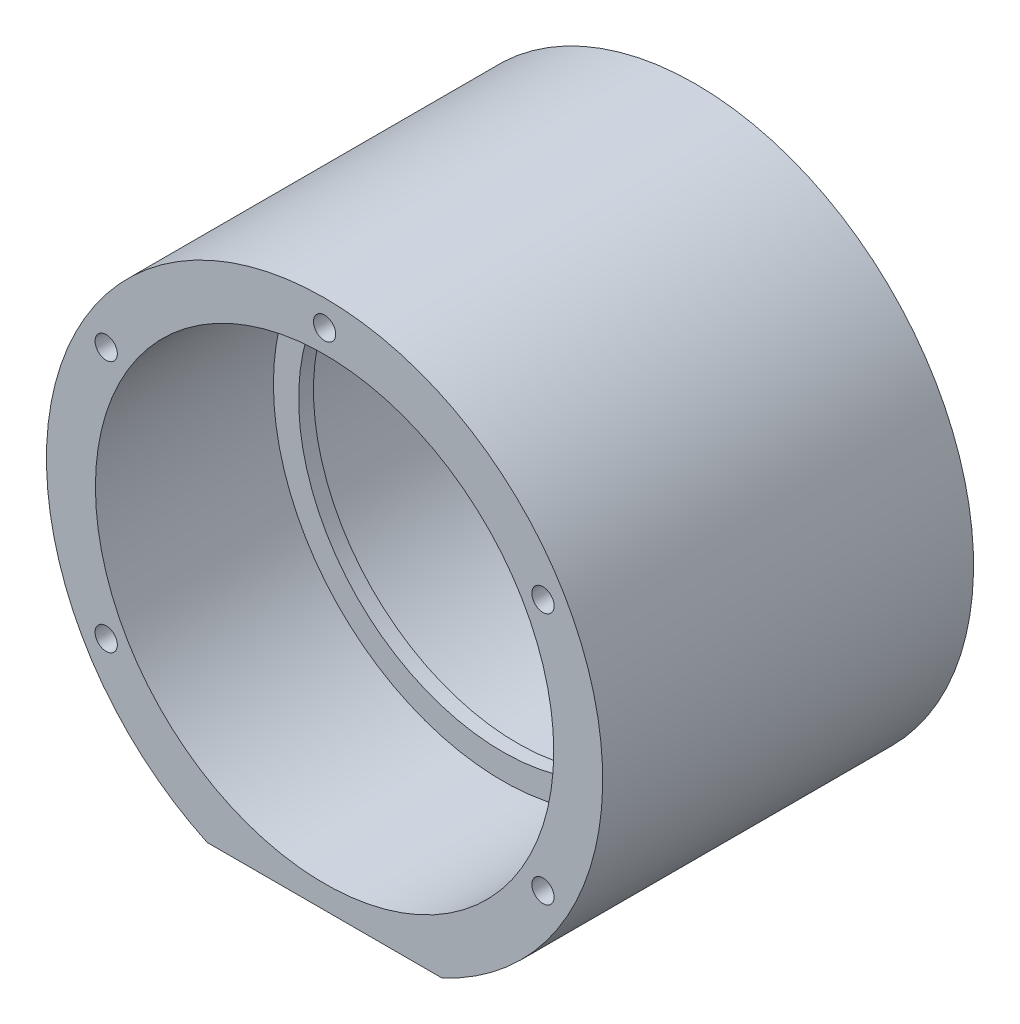
ISO-10303-21;
HEADER;
FILE_DESCRIPTION(('STEP AP214'),'2;1');
FILE_NAME('part.step','',(''),(''),'','','');
FILE_SCHEMA(('AUTOMOTIVE_DESIGN { 1 0 10303 214 1 1 1 1 }'));
ENDSEC;
DATA;
#1=APPLICATION_CONTEXT('core data for automotive mechanical design processes');
#2=APPLICATION_PROTOCOL_DEFINITION('international standard','automotive_design',2000,#1);
#3=PRODUCT_CONTEXT('',#1,'mechanical');
#4=PRODUCT('Part','Part','',(#3));
#5=PRODUCT_RELATED_PRODUCT_CATEGORY('part','',(#4));
#6=PRODUCT_DEFINITION_FORMATION('','',#4);
#7=PRODUCT_DEFINITION_CONTEXT('part definition',#1,'design');
#8=PRODUCT_DEFINITION('design','',#6,#7);
#9=PRODUCT_DEFINITION_SHAPE('','',#8);
#10=(LENGTH_UNIT() NAMED_UNIT(*) SI_UNIT(.MILLI.,.METRE.));
#11=(NAMED_UNIT(*) PLANE_ANGLE_UNIT() SI_UNIT($,.RADIAN.));
#12=(NAMED_UNIT(*) SI_UNIT($,.STERADIAN.) SOLID_ANGLE_UNIT());
#13=UNCERTAINTY_MEASURE_WITH_UNIT(LENGTH_MEASURE(1.E-05),#10,'distance_accuracy_value','');
#14=(GEOMETRIC_REPRESENTATION_CONTEXT(3) GLOBAL_UNCERTAINTY_ASSIGNED_CONTEXT((#13)) GLOBAL_UNIT_ASSIGNED_CONTEXT((#10,
#11,#12)) REPRESENTATION_CONTEXT('',''));
#15=CARTESIAN_POINT('',(0.,0.,0.));
#16=DIRECTION('',(0.,0.,1.));
#17=DIRECTION('',(1.,0.,0.));
#18=AXIS2_PLACEMENT_3D('',#15,#16,#17);
#19=CARTESIAN_POINT('',(0.,0.,50.));
#20=DIRECTION('',(0.,0.,-1.));
#21=DIRECTION('',(-1.,0.,0.));
#22=AXIS2_PLACEMENT_3D('',#19,#20,#21);
#23=CYLINDRICAL_SURFACE('',#22,30.9);
#24=CARTESIAN_POINT('',(0.,0.,0.));
#25=DIRECTION('',(0.,0.,1.));
#26=DIRECTION('',(1.,0.,0.));
#27=AXIS2_PLACEMENT_3D('',#24,#25,#26);
#28=CIRCLE('',#27,30.9);
#29=CARTESIAN_POINT('',(30.9,0.,0.));
#30=VERTEX_POINT('',#29);
#31=EDGE_CURVE('E76',#30,#30,#28,.T.);
#32=ORIENTED_EDGE('',*,*,#31,.F.);
#33=EDGE_LOOP('',(#32));
#34=FACE_BOUND('',#33,.T.);
#35=CARTESIAN_POINT('',(0.,0.,24.));
#36=DIRECTION('',(0.,0.,1.));
#37=DIRECTION('',(1.,0.,0.));
#38=AXIS2_PLACEMENT_3D('',#35,#36,#37);
#39=CIRCLE('',#38,30.9);
#40=CARTESIAN_POINT('',(30.9,0.,24.));
#41=VERTEX_POINT('',#40);
#42=EDGE_CURVE('E111',#41,#41,#39,.T.);
#43=ORIENTED_EDGE('',*,*,#42,.T.);
#44=EDGE_LOOP('',(#43));
#45=FACE_BOUND('',#44,.T.);
#46=ADVANCED_FACE('F33',(#34,#45),#23,.F.);
#47=CARTESIAN_POINT('',(0.,0.,50.));
#48=DIRECTION('',(0.,0.,1.));
#49=DIRECTION('',(1.,0.,0.));
#50=AXIS2_PLACEMENT_3D('',#47,#48,#49);
#51=PLANE('',#50);
#52=CARTESIAN_POINT('',(-29.444863728671,-16.9999999999999,50.));
#53=DIRECTION('',(0.,0.,1.));
#54=DIRECTION('',(1.,0.,0.));
#55=AXIS2_PLACEMENT_3D('',#52,#53,#54);
#56=CIRCLE('',#55,1.50000000000016);
#57=CARTESIAN_POINT('',(-27.9448637286709,-16.9999999999999,50.));
#58=VERTEX_POINT('',#57);
#59=EDGE_CURVE('E99',#58,#58,#56,.T.);
#60=ORIENTED_EDGE('',*,*,#59,.F.);
#61=EDGE_LOOP('',(#60));
#62=FACE_BOUND('',#61,.T.);
#63=CARTESIAN_POINT('',(29.444863728671,16.9999999999999,50.));
#64=DIRECTION('',(0.,0.,1.));
#65=DIRECTION('',(1.,0.,0.));
#66=AXIS2_PLACEMENT_3D('',#63,#64,#65);
#67=CIRCLE('',#66,1.5);
#68=CARTESIAN_POINT('',(30.944863728671,16.9999999999999,50.));
#69=VERTEX_POINT('',#68);
#70=EDGE_CURVE('E87',#69,#69,#67,.T.);
#71=ORIENTED_EDGE('',*,*,#70,.F.);
#72=EDGE_LOOP('',(#71));
#73=FACE_BOUND('',#72,.T.);
#74=CARTESIAN_POINT('',(0.,0.,50.));
#75=DIRECTION('',(0.,0.,1.));
#76=DIRECTION('',(1.,0.,0.));
#77=AXIS2_PLACEMENT_3D('',#74,#75,#76);
#78=CIRCLE('',#77,30.9);
#79=CARTESIAN_POINT('',(30.9,0.,50.));
#80=VERTEX_POINT('',#79);
#81=EDGE_CURVE('E73',#80,#80,#78,.T.);
#82=ORIENTED_EDGE('',*,*,#81,.F.);
#83=EDGE_LOOP('',(#82));
#84=FACE_BOUND('',#83,.T.);
#85=CARTESIAN_POINT('',(0.,0.,50.));
#86=DIRECTION('',(0.,0.,1.));
#87=DIRECTION('',(1.,0.,0.));
#88=AXIS2_PLACEMENT_3D('',#85,#86,#87);
#89=CIRCLE('',#88,37.5);
#90=CARTESIAN_POINT('',(15.8192920195564,-34.,50.));
#91=VERTEX_POINT('',#90);
#92=CARTESIAN_POINT('',(-15.8192920195564,-34.,50.));
#93=VERTEX_POINT('',#92);
#94=EDGE_CURVE('E66',#91,#93,#89,.T.);
#95=ORIENTED_EDGE('',*,*,#94,.T.);
#96=DIRECTION('',(1.,0.,0.));
#97=VECTOR('',#96,1.);
#98=CARTESIAN_POINT('',(-15.8192920195564,-34.,50.));
#99=LINE('',#98,#97);
#100=EDGE_CURVE('E49',#93,#91,#99,.T.);
#101=ORIENTED_EDGE('',*,*,#100,.T.);
#102=EDGE_LOOP('',(#95,#101));
#103=FACE_BOUND('',#102,.T.);
#104=CARTESIAN_POINT('',(0.,34.,50.));
#105=DIRECTION('',(0.,0.,1.));
#106=DIRECTION('',(1.,0.,0.));
#107=AXIS2_PLACEMENT_3D('',#104,#105,#106);
#108=CIRCLE('',#107,1.5);
#109=CARTESIAN_POINT('',(1.5,34.,50.));
#110=VERTEX_POINT('',#109);
#111=EDGE_CURVE('E82',#110,#110,#108,.T.);
#112=ORIENTED_EDGE('',*,*,#111,.F.);
#113=EDGE_LOOP('',(#112));
#114=FACE_BOUND('',#113,.T.);
#115=CARTESIAN_POINT('',(29.4448637286708,-17.0000000000001,50.));
#116=DIRECTION('',(0.,0.,1.));
#117=DIRECTION('',(1.,0.,0.));
#118=AXIS2_PLACEMENT_3D('',#115,#116,#117);
#119=CIRCLE('',#118,1.50000000000005);
#120=CARTESIAN_POINT('',(30.9448637286708,-17.0000000000001,50.));
#121=VERTEX_POINT('',#120);
#122=EDGE_CURVE('E93',#121,#121,#119,.T.);
#123=ORIENTED_EDGE('',*,*,#122,.F.);
#124=EDGE_LOOP('',(#123));
#125=FACE_BOUND('',#124,.T.);
#126=CARTESIAN_POINT('',(-29.4448637286707,17.0000000000003,50.));
#127=DIRECTION('',(0.,0.,1.));
#128=DIRECTION('',(1.,0.,0.));
#129=AXIS2_PLACEMENT_3D('',#126,#127,#128);
#130=CIRCLE('',#129,1.5);
#131=CARTESIAN_POINT('',(-27.9448637286707,17.0000000000003,50.));
#132=VERTEX_POINT('',#131);
#133=EDGE_CURVE('E105',#132,#132,#130,.T.);
#134=ORIENTED_EDGE('',*,*,#133,.F.);
#135=EDGE_LOOP('',(#134));
#136=FACE_BOUND('',#135,.T.);
#137=ADVANCED_FACE('F136',(#62,#73,#84,#103,#114,#125,#136),#51,.T.);
#138=CARTESIAN_POINT('',(0.,0.,0.));
#139=DIRECTION('',(0.,0.,1.));
#140=DIRECTION('',(1.,0.,0.));
#141=AXIS2_PLACEMENT_3D('',#138,#139,#140);
#142=PLANE('',#141);
#143=CARTESIAN_POINT('',(0.,0.,0.));
#144=DIRECTION('',(0.,0.,1.));
#145=DIRECTION('',(1.,0.,0.));
#146=AXIS2_PLACEMENT_3D('',#143,#144,#145);
#147=CIRCLE('',#146,37.5);
#148=CARTESIAN_POINT('',(15.8192920195564,-34.,0.));
#149=VERTEX_POINT('',#148);
#150=CARTESIAN_POINT('',(-15.8192920195564,-34.,0.));
#151=VERTEX_POINT('',#150);
#152=EDGE_CURVE('E67',#149,#151,#147,.T.);
#153=ORIENTED_EDGE('',*,*,#152,.F.);
#154=DIRECTION('',(1.,0.,0.));
#155=VECTOR('',#154,1.);
#156=CARTESIAN_POINT('',(-15.8192920195564,-34.,0.));
#157=LINE('',#156,#155);
#158=EDGE_CURVE('E57',#151,#149,#157,.T.);
#159=ORIENTED_EDGE('',*,*,#158,.F.);
#160=EDGE_LOOP('',(#153,#159));
#161=FACE_BOUND('',#160,.T.);
#162=ORIENTED_EDGE('',*,*,#31,.T.);
#163=EDGE_LOOP('',(#162));
#164=FACE_BOUND('',#163,.T.);
#165=CARTESIAN_POINT('',(0.,34.,0.));
#166=DIRECTION('',(0.,0.,1.));
#167=DIRECTION('',(1.,0.,0.));
#168=AXIS2_PLACEMENT_3D('',#165,#166,#167);
#169=CIRCLE('',#168,1.5);
#170=CARTESIAN_POINT('',(1.5,34.,0.));
#171=VERTEX_POINT('',#170);
#172=EDGE_CURVE('E84',#171,#171,#169,.T.);
#173=ORIENTED_EDGE('',*,*,#172,.T.);
#174=EDGE_LOOP('',(#173));
#175=FACE_BOUND('',#174,.T.);
#176=CARTESIAN_POINT('',(29.444863728671,16.9999999999999,0.));
#177=DIRECTION('',(0.,0.,1.));
#178=DIRECTION('',(1.,0.,0.));
#179=AXIS2_PLACEMENT_3D('',#176,#177,#178);
#180=CIRCLE('',#179,1.5);
#181=CARTESIAN_POINT('',(30.944863728671,16.9999999999999,0.));
#182=VERTEX_POINT('',#181);
#183=EDGE_CURVE('E90',#182,#182,#180,.T.);
#184=ORIENTED_EDGE('',*,*,#183,.T.);
#185=EDGE_LOOP('',(#184));
#186=FACE_BOUND('',#185,.T.);
#187=CARTESIAN_POINT('',(29.4448637286708,-17.0000000000001,0.));
#188=DIRECTION('',(0.,0.,1.));
#189=DIRECTION('',(1.,0.,0.));
#190=AXIS2_PLACEMENT_3D('',#187,#188,#189);
#191=CIRCLE('',#190,1.50000000000005);
#192=CARTESIAN_POINT('',(30.9448637286708,-17.0000000000001,0.));
#193=VERTEX_POINT('',#192);
#194=EDGE_CURVE('E96',#193,#193,#191,.T.);
#195=ORIENTED_EDGE('',*,*,#194,.T.);
#196=EDGE_LOOP('',(#195));
#197=FACE_BOUND('',#196,.T.);
#198=CARTESIAN_POINT('',(-29.444863728671,-16.9999999999999,0.));
#199=DIRECTION('',(0.,0.,1.));
#200=DIRECTION('',(1.,0.,0.));
#201=AXIS2_PLACEMENT_3D('',#198,#199,#200);
#202=CIRCLE('',#201,1.50000000000016);
#203=CARTESIAN_POINT('',(-27.9448637286709,-16.9999999999999,0.));
#204=VERTEX_POINT('',#203);
#205=EDGE_CURVE('E102',#204,#204,#202,.T.);
#206=ORIENTED_EDGE('',*,*,#205,.T.);
#207=EDGE_LOOP('',(#206));
#208=FACE_BOUND('',#207,.T.);
#209=CARTESIAN_POINT('',(-29.4448637286707,17.0000000000003,0.));
#210=DIRECTION('',(0.,0.,1.));
#211=DIRECTION('',(1.,0.,0.));
#212=AXIS2_PLACEMENT_3D('',#209,#210,#211);
#213=CIRCLE('',#212,1.5);
#214=CARTESIAN_POINT('',(-27.9448637286707,17.0000000000003,0.));
#215=VERTEX_POINT('',#214);
#216=EDGE_CURVE('E108',#215,#215,#213,.T.);
#217=ORIENTED_EDGE('',*,*,#216,.T.);
#218=EDGE_LOOP('',(#217));
#219=FACE_BOUND('',#218,.T.);
#220=ADVANCED_FACE('F71',(#161,#164,#175,#186,#197,#208,#219),#142,.F.);
#221=CARTESIAN_POINT('',(0.,0.,50.));
#222=DIRECTION('',(0.,0.,-1.));
#223=DIRECTION('',(-1.,0.,0.));
#224=AXIS2_PLACEMENT_3D('',#221,#222,#223);
#225=CYLINDRICAL_SURFACE('',#224,37.5);
#226=ORIENTED_EDGE('',*,*,#152,.T.);
#227=DIRECTION('',(0.,0.,-1.));
#228=VECTOR('',#227,1.);
#229=CARTESIAN_POINT('',(-15.8192920195564,-34.,50.));
#230=LINE('',#229,#228);
#231=EDGE_CURVE('E42',#93,#151,#230,.T.);
#232=ORIENTED_EDGE('',*,*,#231,.F.);
#233=ORIENTED_EDGE('',*,*,#94,.F.);
#234=DIRECTION('',(0.,0.,-1.));
#235=VECTOR('',#234,1.);
#236=CARTESIAN_POINT('',(15.8192920195564,-34.,50.));
#237=LINE('',#236,#235);
#238=EDGE_CURVE('E62',#91,#149,#237,.T.);
#239=ORIENTED_EDGE('',*,*,#238,.T.);
#240=EDGE_LOOP('',(#226,#232,#233,#239));
#241=FACE_BOUND('',#240,.T.);
#242=ADVANCED_FACE('F35',(#241),#225,.T.);
#243=CARTESIAN_POINT('',(-15.8192920195564,-34.,50.));
#244=DIRECTION('',(0.,1.,0.));
#245=DIRECTION('',(0.,0.,1.));
#246=AXIS2_PLACEMENT_3D('',#243,#244,#245);
#247=PLANE('',#246);
#248=ORIENTED_EDGE('',*,*,#158,.T.);
#249=ORIENTED_EDGE('',*,*,#238,.F.);
#250=ORIENTED_EDGE('',*,*,#100,.F.);
#251=ORIENTED_EDGE('',*,*,#231,.T.);
#252=EDGE_LOOP('',(#248,#249,#250,#251));
#253=FACE_BOUND('',#252,.T.);
#254=ADVANCED_FACE('F61',(#253),#247,.F.);
#255=CARTESIAN_POINT('',(0.,0.,26.));
#256=DIRECTION('',(0.,0.,1.));
#257=DIRECTION('',(1.,0.,0.));
#258=AXIS2_PLACEMENT_3D('',#255,#256,#257);
#259=CIRCLE('',#258,30.9);
#260=CARTESIAN_POINT('',(30.9,0.,26.));
#261=VERTEX_POINT('',#260);
#262=EDGE_CURVE('E11',#261,#261,#259,.T.);
#263=ORIENTED_EDGE('',*,*,#262,.F.);
#264=EDGE_LOOP('',(#263));
#265=FACE_BOUND('',#264,.T.);
#266=ORIENTED_EDGE('',*,*,#81,.T.);
#267=EDGE_LOOP('',(#266));
#268=FACE_BOUND('',#267,.T.);
#269=ADVANCED_FACE('F139',(#265,#268),#23,.F.);
#270=CARTESIAN_POINT('',(0.,34.,50.));
#271=DIRECTION('',(0.,0.,-1.));
#272=DIRECTION('',(-1.,0.,0.));
#273=AXIS2_PLACEMENT_3D('',#270,#271,#272);
#274=CYLINDRICAL_SURFACE('',#273,1.5);
#275=ORIENTED_EDGE('',*,*,#111,.T.);
#276=EDGE_LOOP('',(#275));
#277=FACE_BOUND('',#276,.T.);
#278=ORIENTED_EDGE('',*,*,#172,.F.);
#279=EDGE_LOOP('',(#278));
#280=FACE_BOUND('',#279,.T.);
#281=ADVANCED_FACE('F149',(#277,#280),#274,.F.);
#282=CARTESIAN_POINT('',(29.444863728671,16.9999999999999,50.));
#283=DIRECTION('',(0.,0.,-1.));
#284=DIRECTION('',(-1.,0.,0.));
#285=AXIS2_PLACEMENT_3D('',#282,#283,#284);
#286=CYLINDRICAL_SURFACE('',#285,1.5);
#287=ORIENTED_EDGE('',*,*,#70,.T.);
#288=EDGE_LOOP('',(#287));
#289=FACE_BOUND('',#288,.T.);
#290=ORIENTED_EDGE('',*,*,#183,.F.);
#291=EDGE_LOOP('',(#290));
#292=FACE_BOUND('',#291,.T.);
#293=ADVANCED_FACE('F155',(#289,#292),#286,.F.);
#294=CARTESIAN_POINT('',(29.4448637286708,-17.0000000000001,50.));
#295=DIRECTION('',(0.,0.,-1.));
#296=DIRECTION('',(-1.,0.,0.));
#297=AXIS2_PLACEMENT_3D('',#294,#295,#296);
#298=CYLINDRICAL_SURFACE('',#297,1.50000000000005);
#299=ORIENTED_EDGE('',*,*,#122,.T.);
#300=EDGE_LOOP('',(#299));
#301=FACE_BOUND('',#300,.T.);
#302=ORIENTED_EDGE('',*,*,#194,.F.);
#303=EDGE_LOOP('',(#302));
#304=FACE_BOUND('',#303,.T.);
#305=ADVANCED_FACE('F202',(#301,#304),#298,.F.);
#306=CARTESIAN_POINT('',(-29.444863728671,-16.9999999999999,50.));
#307=DIRECTION('',(0.,0.,-1.));
#308=DIRECTION('',(-1.,0.,0.));
#309=AXIS2_PLACEMENT_3D('',#306,#307,#308);
#310=CYLINDRICAL_SURFACE('',#309,1.50000000000016);
#311=ORIENTED_EDGE('',*,*,#59,.T.);
#312=EDGE_LOOP('',(#311));
#313=FACE_BOUND('',#312,.T.);
#314=ORIENTED_EDGE('',*,*,#205,.F.);
#315=EDGE_LOOP('',(#314));
#316=FACE_BOUND('',#315,.T.);
#317=ADVANCED_FACE('F171',(#313,#316),#310,.F.);
#318=CARTESIAN_POINT('',(-29.4448637286707,17.0000000000003,50.));
#319=DIRECTION('',(0.,0.,-1.));
#320=DIRECTION('',(-1.,0.,0.));
#321=AXIS2_PLACEMENT_3D('',#318,#319,#320);
#322=CYLINDRICAL_SURFACE('',#321,1.5);
#323=ORIENTED_EDGE('',*,*,#133,.T.);
#324=EDGE_LOOP('',(#323));
#325=FACE_BOUND('',#324,.T.);
#326=ORIENTED_EDGE('',*,*,#216,.F.);
#327=EDGE_LOOP('',(#326));
#328=FACE_BOUND('',#327,.T.);
#329=ADVANCED_FACE('F168',(#325,#328),#322,.F.);
#330=CARTESIAN_POINT('',(0.,0.,24.));
#331=DIRECTION('',(0.,0.,1.));
#332=DIRECTION('',(1.,0.,0.));
#333=AXIS2_PLACEMENT_3D('',#330,#331,#332);
#334=PLANE('',#333);
#335=CARTESIAN_POINT('',(0.,0.,24.));
#336=DIRECTION('',(0.,0.,1.));
#337=DIRECTION('',(1.,0.,0.));
#338=AXIS2_PLACEMENT_3D('',#335,#336,#337);
#339=CIRCLE('',#338,27.5);
#340=CARTESIAN_POINT('',(27.5,0.,24.));
#341=VERTEX_POINT('',#340);
#342=EDGE_CURVE('E116',#341,#341,#339,.T.);
#343=ORIENTED_EDGE('',*,*,#342,.T.);
#344=EDGE_LOOP('',(#343));
#345=FACE_BOUND('',#344,.T.);
#346=ORIENTED_EDGE('',*,*,#42,.F.);
#347=EDGE_LOOP('',(#346));
#348=FACE_BOUND('',#347,.T.);
#349=ADVANCED_FACE('F132',(#345,#348),#334,.F.);
#350=CARTESIAN_POINT('',(0.,0.,24.));
#351=DIRECTION('',(0.,0.,1.));
#352=DIRECTION('',(1.,0.,0.));
#353=AXIS2_PLACEMENT_3D('',#350,#351,#352);
#354=CYLINDRICAL_SURFACE('',#353,27.5);
#355=ORIENTED_EDGE('',*,*,#342,.F.);
#356=EDGE_LOOP('',(#355));
#357=FACE_BOUND('',#356,.T.);
#358=CARTESIAN_POINT('',(0.,0.,26.));
#359=DIRECTION('',(0.,0.,1.));
#360=DIRECTION('',(1.,0.,0.));
#361=AXIS2_PLACEMENT_3D('',#358,#359,#360);
#362=CIRCLE('',#361,27.5);
#363=CARTESIAN_POINT('',(27.5,0.,26.));
#364=VERTEX_POINT('',#363);
#365=EDGE_CURVE('E119',#364,#364,#362,.T.);
#366=ORIENTED_EDGE('',*,*,#365,.T.);
#367=EDGE_LOOP('',(#366));
#368=FACE_BOUND('',#367,.T.);
#369=ADVANCED_FACE('F123',(#357,#368),#354,.F.);
#370=CARTESIAN_POINT('',(0.,0.,26.));
#371=DIRECTION('',(0.,0.,1.));
#372=DIRECTION('',(1.,0.,0.));
#373=AXIS2_PLACEMENT_3D('',#370,#371,#372);
#374=PLANE('',#373);
#375=ORIENTED_EDGE('',*,*,#262,.T.);
#376=EDGE_LOOP('',(#375));
#377=FACE_BOUND('',#376,.T.);
#378=ORIENTED_EDGE('',*,*,#365,.F.);
#379=EDGE_LOOP('',(#378));
#380=FACE_BOUND('',#379,.T.);
#381=ADVANCED_FACE('F125',(#377,#380),#374,.T.);
#382=CLOSED_SHELL('',(#46,#137,#220,#242,#254,#269,#281,#293,#305,#317,#329,#349,#369,#381));
#383=MANIFOLD_SOLID_BREP('B2',#382);
#384=ADVANCED_BREP_SHAPE_REPRESENTATION('',(#18,#383),#14);
#385=SHAPE_DEFINITION_REPRESENTATION(#9,#384);
ENDSEC;
END-ISO-10303-21;
